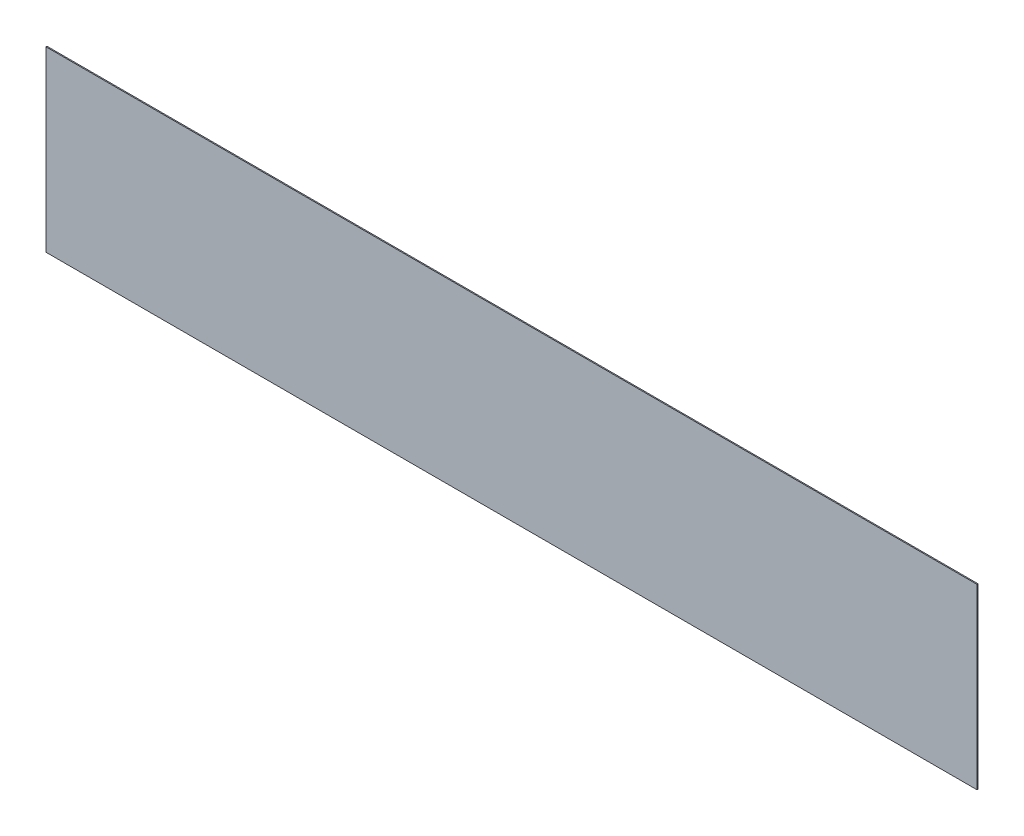
ISO-10303-21;
HEADER;
FILE_DESCRIPTION(('STEP AP214'),'2;1');
FILE_NAME('part.step','',(''),(''),'','','');
FILE_SCHEMA(('AUTOMOTIVE_DESIGN { 1 0 10303 214 1 1 1 1 }'));
ENDSEC;
DATA;
#1=APPLICATION_CONTEXT('core data for automotive mechanical design processes');
#2=APPLICATION_PROTOCOL_DEFINITION('international standard','automotive_design',2000,#1);
#3=PRODUCT_CONTEXT('',#1,'mechanical');
#4=PRODUCT('Part','Part','',(#3));
#5=PRODUCT_RELATED_PRODUCT_CATEGORY('part','',(#4));
#6=PRODUCT_DEFINITION_FORMATION('','',#4);
#7=PRODUCT_DEFINITION_CONTEXT('part definition',#1,'design');
#8=PRODUCT_DEFINITION('design','',#6,#7);
#9=PRODUCT_DEFINITION_SHAPE('','',#8);
#10=(LENGTH_UNIT() NAMED_UNIT(*) SI_UNIT(.MILLI.,.METRE.));
#11=(NAMED_UNIT(*) PLANE_ANGLE_UNIT() SI_UNIT($,.RADIAN.));
#12=(NAMED_UNIT(*) SI_UNIT($,.STERADIAN.) SOLID_ANGLE_UNIT());
#13=UNCERTAINTY_MEASURE_WITH_UNIT(LENGTH_MEASURE(1.E-05),#10,'distance_accuracy_value','');
#14=(GEOMETRIC_REPRESENTATION_CONTEXT(3) GLOBAL_UNCERTAINTY_ASSIGNED_CONTEXT((#13)) GLOBAL_UNIT_ASSIGNED_CONTEXT((#10,
#11,#12)) REPRESENTATION_CONTEXT('',''));
#15=CARTESIAN_POINT('',(0.,0.,0.));
#16=DIRECTION('',(0.,0.,1.));
#17=DIRECTION('',(1.,0.,0.));
#18=AXIS2_PLACEMENT_3D('',#15,#16,#17);
#19=CARTESIAN_POINT('',(-237.,-444.239987925377,0.5));
#20=DIRECTION('',(1.,0.,0.));
#21=DIRECTION('',(0.,0.,-1.));
#22=AXIS2_PLACEMENT_3D('',#19,#20,#21);
#23=PLANE('',#22);
#24=DIRECTION('',(0.,-1.,0.));
#25=VECTOR('',#24,1.);
#26=CARTESIAN_POINT('',(-237.,-444.239987925377,0.));
#27=LINE('',#26,#25);
#28=CARTESIAN_POINT('',(-237.,-444.239987925377,0.));
#29=VERTEX_POINT('',#28);
#30=CARTESIAN_POINT('',(-237.,-530.239987925377,0.));
#31=VERTEX_POINT('',#30);
#32=EDGE_CURVE('E98',#29,#31,#27,.T.);
#33=ORIENTED_EDGE('',*,*,#32,.T.);
#34=DIRECTION('',(0.,0.,-1.));
#35=VECTOR('',#34,1.);
#36=CARTESIAN_POINT('',(-237.,-530.239987925377,0.5));
#37=LINE('',#36,#35);
#38=CARTESIAN_POINT('',(-237.,-530.239987925377,0.5));
#39=VERTEX_POINT('',#38);
#40=EDGE_CURVE('E11',#39,#31,#37,.T.);
#41=ORIENTED_EDGE('',*,*,#40,.F.);
#42=DIRECTION('',(0.,-1.,0.));
#43=VECTOR('',#42,1.);
#44=CARTESIAN_POINT('',(-237.,-444.239987925377,0.5));
#45=LINE('',#44,#43);
#46=CARTESIAN_POINT('',(-237.,-444.239987925377,0.5));
#47=VERTEX_POINT('',#46);
#48=EDGE_CURVE('E86',#47,#39,#45,.T.);
#49=ORIENTED_EDGE('',*,*,#48,.F.);
#50=DIRECTION('',(0.,0.,-1.));
#51=VECTOR('',#50,1.);
#52=CARTESIAN_POINT('',(-237.,-444.239987925377,0.5));
#53=LINE('',#52,#51);
#54=EDGE_CURVE('E94',#47,#29,#53,.T.);
#55=ORIENTED_EDGE('',*,*,#54,.T.);
#56=EDGE_LOOP('',(#33,#41,#49,#55));
#57=FACE_BOUND('',#56,.T.);
#58=ADVANCED_FACE('F35',(#57),#23,.F.);
#59=CARTESIAN_POINT('',(-237.,-530.239987925377,0.5));
#60=DIRECTION('',(0.,1.,0.));
#61=DIRECTION('',(0.,0.,1.));
#62=AXIS2_PLACEMENT_3D('',#59,#60,#61);
#63=PLANE('',#62);
#64=DIRECTION('',(1.,0.,0.));
#65=VECTOR('',#64,1.);
#66=CARTESIAN_POINT('',(-237.,-530.239987925377,0.));
#67=LINE('',#66,#65);
#68=CARTESIAN_POINT('',(213.,-530.239987925377,0.));
#69=VERTEX_POINT('',#68);
#70=EDGE_CURVE('E90',#31,#69,#67,.T.);
#71=ORIENTED_EDGE('',*,*,#70,.T.);
#72=DIRECTION('',(0.,0.,-1.));
#73=VECTOR('',#72,1.);
#74=CARTESIAN_POINT('',(213.,-530.239987925377,0.5));
#75=LINE('',#74,#73);
#76=CARTESIAN_POINT('',(213.,-530.239987925377,0.5));
#77=VERTEX_POINT('',#76);
#78=EDGE_CURVE('E43',#77,#69,#75,.T.);
#79=ORIENTED_EDGE('',*,*,#78,.F.);
#80=DIRECTION('',(1.,0.,0.));
#81=VECTOR('',#80,1.);
#82=CARTESIAN_POINT('',(-237.,-530.239987925377,0.5));
#83=LINE('',#82,#81);
#84=EDGE_CURVE('E81',#39,#77,#83,.T.);
#85=ORIENTED_EDGE('',*,*,#84,.F.);
#86=ORIENTED_EDGE('',*,*,#40,.T.);
#87=EDGE_LOOP('',(#71,#79,#85,#86));
#88=FACE_BOUND('',#87,.T.);
#89=ADVANCED_FACE('F89',(#88),#63,.F.);
#90=CARTESIAN_POINT('',(213.,-444.239987925377,0.5));
#91=DIRECTION('',(-1.,0.,0.));
#92=DIRECTION('',(0.,0.,1.));
#93=AXIS2_PLACEMENT_3D('',#90,#91,#92);
#94=PLANE('',#93);
#95=DIRECTION('',(0.,1.,0.));
#96=VECTOR('',#95,1.);
#97=CARTESIAN_POINT('',(213.,-444.239987925377,0.));
#98=LINE('',#97,#96);
#99=CARTESIAN_POINT('',(213.,-444.239987925377,0.));
#100=VERTEX_POINT('',#99);
#101=EDGE_CURVE('E68',#69,#100,#98,.T.);
#102=ORIENTED_EDGE('',*,*,#101,.T.);
#103=DIRECTION('',(0.,0.,-1.));
#104=VECTOR('',#103,1.);
#105=CARTESIAN_POINT('',(213.,-444.239987925377,0.5));
#106=LINE('',#105,#104);
#107=CARTESIAN_POINT('',(213.,-444.239987925377,0.5));
#108=VERTEX_POINT('',#107);
#109=EDGE_CURVE('E91',#108,#100,#106,.T.);
#110=ORIENTED_EDGE('',*,*,#109,.F.);
#111=DIRECTION('',(0.,1.,0.));
#112=VECTOR('',#111,1.);
#113=CARTESIAN_POINT('',(213.,-444.239987925377,0.5));
#114=LINE('',#113,#112);
#115=EDGE_CURVE('E84',#77,#108,#114,.T.);
#116=ORIENTED_EDGE('',*,*,#115,.F.);
#117=ORIENTED_EDGE('',*,*,#78,.T.);
#118=EDGE_LOOP('',(#102,#110,#116,#117));
#119=FACE_BOUND('',#118,.T.);
#120=ADVANCED_FACE('F92',(#119),#94,.F.);
#121=CARTESIAN_POINT('',(-237.,-444.239987925377,0.5));
#122=DIRECTION('',(0.,-1.,0.));
#123=DIRECTION('',(0.,0.,-1.));
#124=AXIS2_PLACEMENT_3D('',#121,#122,#123);
#125=PLANE('',#124);
#126=DIRECTION('',(-1.,0.,0.));
#127=VECTOR('',#126,1.);
#128=CARTESIAN_POINT('',(-237.,-444.239987925377,0.));
#129=LINE('',#128,#127);
#130=EDGE_CURVE('E74',#100,#29,#129,.T.);
#131=ORIENTED_EDGE('',*,*,#130,.T.);
#132=ORIENTED_EDGE('',*,*,#54,.F.);
#133=DIRECTION('',(-1.,0.,0.));
#134=VECTOR('',#133,1.);
#135=CARTESIAN_POINT('',(-237.,-444.239987925377,0.5));
#136=LINE('',#135,#134);
#137=EDGE_CURVE('E51',#108,#47,#136,.T.);
#138=ORIENTED_EDGE('',*,*,#137,.F.);
#139=ORIENTED_EDGE('',*,*,#109,.T.);
#140=EDGE_LOOP('',(#131,#132,#138,#139));
#141=FACE_BOUND('',#140,.T.);
#142=ADVANCED_FACE('F105',(#141),#125,.F.);
#143=CARTESIAN_POINT('',(0.,0.,0.5));
#144=DIRECTION('',(0.,0.,1.));
#145=DIRECTION('',(1.,0.,0.));
#146=AXIS2_PLACEMENT_3D('',#143,#144,#145);
#147=PLANE('',#146);
#148=ORIENTED_EDGE('',*,*,#48,.T.);
#149=ORIENTED_EDGE('',*,*,#84,.T.);
#150=ORIENTED_EDGE('',*,*,#115,.T.);
#151=ORIENTED_EDGE('',*,*,#137,.T.);
#152=EDGE_LOOP('',(#148,#149,#150,#151));
#153=FACE_BOUND('',#152,.T.);
#154=ADVANCED_FACE('F82',(#153),#147,.T.);
#155=CARTESIAN_POINT('',(0.,0.,0.));
#156=DIRECTION('',(0.,0.,1.));
#157=DIRECTION('',(1.,0.,0.));
#158=AXIS2_PLACEMENT_3D('',#155,#156,#157);
#159=PLANE('',#158);
#160=ORIENTED_EDGE('',*,*,#32,.F.);
#161=ORIENTED_EDGE('',*,*,#130,.F.);
#162=ORIENTED_EDGE('',*,*,#101,.F.);
#163=ORIENTED_EDGE('',*,*,#70,.F.);
#164=EDGE_LOOP('',(#160,#161,#162,#163));
#165=FACE_BOUND('',#164,.T.);
#166=ADVANCED_FACE('F108',(#165),#159,.F.);
#167=CLOSED_SHELL('',(#58,#89,#120,#142,#154,#166));
#168=MANIFOLD_SOLID_BREP('B2',#167);
#169=ADVANCED_BREP_SHAPE_REPRESENTATION('',(#18,#168),#14);
#170=SHAPE_DEFINITION_REPRESENTATION(#9,#169);
ENDSEC;
END-ISO-10303-21;
